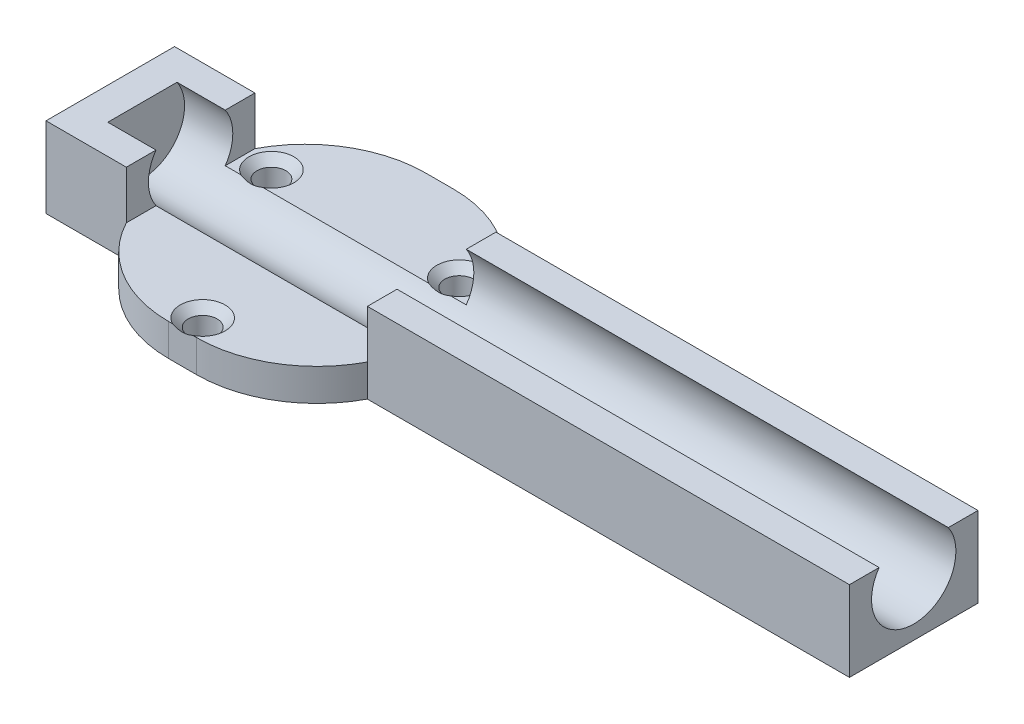
ISO-10303-21;
HEADER;
FILE_DESCRIPTION(('STEP AP214'),'2;1');
FILE_NAME('part.step','',(''),(''),'','','');
FILE_SCHEMA(('AUTOMOTIVE_DESIGN { 1 0 10303 214 1 1 1 1 }'));
ENDSEC;
DATA;
#1=APPLICATION_CONTEXT('core data for automotive mechanical design processes');
#2=APPLICATION_PROTOCOL_DEFINITION('international standard','automotive_design',2000,#1);
#3=PRODUCT_CONTEXT('',#1,'mechanical');
#4=PRODUCT('Part','Part','',(#3));
#5=PRODUCT_RELATED_PRODUCT_CATEGORY('part','',(#4));
#6=PRODUCT_DEFINITION_FORMATION('','',#4);
#7=PRODUCT_DEFINITION_CONTEXT('part definition',#1,'design');
#8=PRODUCT_DEFINITION('design','',#6,#7);
#9=PRODUCT_DEFINITION_SHAPE('','',#8);
#10=(LENGTH_UNIT() NAMED_UNIT(*) SI_UNIT(.MILLI.,.METRE.));
#11=(NAMED_UNIT(*) PLANE_ANGLE_UNIT() SI_UNIT($,.RADIAN.));
#12=(NAMED_UNIT(*) SI_UNIT($,.STERADIAN.) SOLID_ANGLE_UNIT());
#13=UNCERTAINTY_MEASURE_WITH_UNIT(LENGTH_MEASURE(1.E-05),#10,'distance_accuracy_value','');
#14=(GEOMETRIC_REPRESENTATION_CONTEXT(3) GLOBAL_UNCERTAINTY_ASSIGNED_CONTEXT((#13)) GLOBAL_UNIT_ASSIGNED_CONTEXT((#10,
#11,#12)) REPRESENTATION_CONTEXT('',''));
#15=CARTESIAN_POINT('',(0.,0.,0.));
#16=DIRECTION('',(0.,0.,1.));
#17=DIRECTION('',(1.,0.,0.));
#18=AXIS2_PLACEMENT_3D('',#15,#16,#17);
#19=CARTESIAN_POINT('',(30.,4.,8.));
#20=DIRECTION('',(0.,0.,-1.));
#21=DIRECTION('',(-1.,0.,0.));
#22=AXIS2_PLACEMENT_3D('',#19,#20,#21);
#23=PLANE('',#22);
#24=DIRECTION('',(0.,-1.,0.));
#25=VECTOR('',#24,1.);
#26=CARTESIAN_POINT('',(0.,4.,8.));
#27=LINE('',#26,#25);
#28=CARTESIAN_POINT('',(0.,4.,8.));
#29=VERTEX_POINT('',#28);
#30=CARTESIAN_POINT('',(0.,0.,8.));
#31=VERTEX_POINT('',#30);
#32=EDGE_CURVE('E226',#29,#31,#27,.T.);
#33=ORIENTED_EDGE('',*,*,#32,.F.);
#34=DIRECTION('',(0.,-1.,0.));
#35=VECTOR('',#34,1.);
#36=CARTESIAN_POINT('',(0.,10.,8.));
#37=LINE('',#36,#35);
#38=CARTESIAN_POINT('',(0.,10.,8.));
#39=VERTEX_POINT('',#38);
#40=EDGE_CURVE('E213',#39,#29,#37,.T.);
#41=ORIENTED_EDGE('',*,*,#40,.F.);
#42=DIRECTION('',(1.,0.,0.));
#43=VECTOR('',#42,1.);
#44=CARTESIAN_POINT('',(-9.99999999999999,10.,8.));
#45=LINE('',#44,#43);
#46=CARTESIAN_POINT('',(-9.99999999999999,10.,8.));
#47=VERTEX_POINT('',#46);
#48=EDGE_CURVE('E337',#47,#39,#45,.T.);
#49=ORIENTED_EDGE('',*,*,#48,.F.);
#50=DIRECTION('',(0.,-1.,0.));
#51=VECTOR('',#50,1.);
#52=CARTESIAN_POINT('',(-9.99999999999999,4.,8.));
#53=LINE('',#52,#51);
#54=CARTESIAN_POINT('',(-9.99999999999999,0.,8.));
#55=VERTEX_POINT('',#54);
#56=EDGE_CURVE('E232',#47,#55,#53,.T.);
#57=ORIENTED_EDGE('',*,*,#56,.T.);
#58=DIRECTION('',(1.,0.,0.));
#59=VECTOR('',#58,1.);
#60=CARTESIAN_POINT('',(0.,0.,8.));
#61=LINE('',#60,#59);
#62=EDGE_CURVE('E229',#55,#31,#61,.T.);
#63=ORIENTED_EDGE('',*,*,#62,.T.);
#64=EDGE_LOOP('',(#33,#41,#49,#57,#63));
#65=FACE_BOUND('',#64,.T.);
#66=ADVANCED_FACE('F42',(#65),#23,.F.);
#67=CARTESIAN_POINT('',(30.,4.,-8.));
#68=DIRECTION('',(0.,0.,1.));
#69=DIRECTION('',(1.,0.,0.));
#70=AXIS2_PLACEMENT_3D('',#67,#68,#69);
#71=PLANE('',#70);
#72=DIRECTION('',(-1.,0.,0.));
#73=VECTOR('',#72,1.);
#74=CARTESIAN_POINT('',(-9.99999999999999,10.,-8.));
#75=LINE('',#74,#73);
#76=CARTESIAN_POINT('',(0.,10.,-8.));
#77=VERTEX_POINT('',#76);
#78=CARTESIAN_POINT('',(-9.99999999999999,10.,-8.));
#79=VERTEX_POINT('',#78);
#80=EDGE_CURVE('E351',#77,#79,#75,.T.);
#81=ORIENTED_EDGE('',*,*,#80,.F.);
#82=DIRECTION('',(0.,-1.,0.));
#83=VECTOR('',#82,1.);
#84=CARTESIAN_POINT('',(0.,4.,-8.));
#85=LINE('',#84,#83);
#86=CARTESIAN_POINT('',(0.,4.,-8.));
#87=VERTEX_POINT('',#86);
#88=EDGE_CURVE('E502',#77,#87,#85,.T.);
#89=ORIENTED_EDGE('',*,*,#88,.T.);
#90=DIRECTION('',(0.,-1.,0.));
#91=VECTOR('',#90,1.);
#92=CARTESIAN_POINT('',(0.,4.,-8.));
#93=LINE('',#92,#91);
#94=CARTESIAN_POINT('',(0.,0.,-8.));
#95=VERTEX_POINT('',#94);
#96=EDGE_CURVE('E408',#87,#95,#93,.T.);
#97=ORIENTED_EDGE('',*,*,#96,.T.);
#98=DIRECTION('',(-1.,0.,0.));
#99=VECTOR('',#98,1.);
#100=CARTESIAN_POINT('',(0.,0.,-8.));
#101=LINE('',#100,#99);
#102=CARTESIAN_POINT('',(-9.99999999999999,0.,-8.));
#103=VERTEX_POINT('',#102);
#104=EDGE_CURVE('E370',#95,#103,#101,.T.);
#105=ORIENTED_EDGE('',*,*,#104,.T.);
#106=DIRECTION('',(0.,-1.,0.));
#107=VECTOR('',#106,1.);
#108=CARTESIAN_POINT('',(-9.99999999999999,4.,-8.));
#109=LINE('',#108,#107);
#110=EDGE_CURVE('E404',#79,#103,#109,.T.);
#111=ORIENTED_EDGE('',*,*,#110,.F.);
#112=EDGE_LOOP('',(#81,#89,#97,#105,#111));
#113=FACE_BOUND('',#112,.T.);
#114=ADVANCED_FACE('F308',(#113),#71,.F.);
#115=CARTESIAN_POINT('',(0.,10.,0.));
#116=DIRECTION('',(0.,1.,0.));
#117=DIRECTION('',(0.,0.,1.));
#118=AXIS2_PLACEMENT_3D('',#115,#116,#117);
#119=PLANE('',#118);
#120=DIRECTION('',(0.,0.,1.));
#121=VECTOR('',#120,1.);
#122=CARTESIAN_POINT('',(0.,10.,-16.));
#123=LINE('',#122,#121);
#124=CARTESIAN_POINT('',(0.,10.,-4.30842198490352));
#125=VERTEX_POINT('',#124);
#126=EDGE_CURVE('E517',#77,#125,#123,.T.);
#127=ORIENTED_EDGE('',*,*,#126,.F.);
#128=ORIENTED_EDGE('',*,*,#80,.T.);
#129=DIRECTION('',(0.,0.,1.));
#130=VECTOR('',#129,1.);
#131=CARTESIAN_POINT('',(-9.99999999999999,10.,-8.));
#132=LINE('',#131,#130);
#133=EDGE_CURVE('E338',#79,#47,#132,.T.);
#134=ORIENTED_EDGE('',*,*,#133,.T.);
#135=ORIENTED_EDGE('',*,*,#48,.T.);
#136=CARTESIAN_POINT('',(0.,10.,4.30842198490352));
#137=VERTEX_POINT('',#136);
#138=EDGE_CURVE('E217',#137,#39,#123,.T.);
#139=ORIENTED_EDGE('',*,*,#138,.F.);
#140=DIRECTION('',(1.,0.,0.));
#141=VECTOR('',#140,1.);
#142=CARTESIAN_POINT('',(-24.8492424049175,10.,4.30842198490352));
#143=LINE('',#142,#141);
#144=CARTESIAN_POINT('',(-5.99999999999999,10.,4.30842198490352));
#145=VERTEX_POINT('',#144);
#146=EDGE_CURVE('E422',#145,#137,#143,.T.);
#147=ORIENTED_EDGE('',*,*,#146,.F.);
#148=DIRECTION('',(0.,0.,-1.));
#149=VECTOR('',#148,1.);
#150=CARTESIAN_POINT('',(-5.99999999999999,10.,0.));
#151=LINE('',#150,#149);
#152=CARTESIAN_POINT('',(-5.99999999999999,10.,-4.30842198490352));
#153=VERTEX_POINT('',#152);
#154=EDGE_CURVE('E412',#145,#153,#151,.T.);
#155=ORIENTED_EDGE('',*,*,#154,.T.);
#156=DIRECTION('',(1.,0.,0.));
#157=VECTOR('',#156,1.);
#158=CARTESIAN_POINT('',(-24.8492424049175,10.,-4.30842198490352));
#159=LINE('',#158,#157);
#160=EDGE_CURVE('E416',#125,#153,#159,.F.);
#161=ORIENTED_EDGE('',*,*,#160,.F.);
#162=EDGE_LOOP('',(#127,#128,#134,#135,#139,#147,#155,#161));
#163=FACE_BOUND('',#162,.T.);
#164=ADVANCED_FACE('F312',(#163),#119,.T.);
#165=DIRECTION('',(0.,0.,1.));
#166=VECTOR('',#165,1.);
#167=CARTESIAN_POINT('',(30.,10.,-16.));
#168=LINE('',#167,#166);
#169=CARTESIAN_POINT('',(30.,10.,4.30842198490352));
#170=VERTEX_POINT('',#169);
#171=CARTESIAN_POINT('',(30.,10.,8.));
#172=VERTEX_POINT('',#171);
#173=EDGE_CURVE('E533',#170,#172,#168,.T.);
#174=ORIENTED_EDGE('',*,*,#173,.T.);
#175=CARTESIAN_POINT('',(90.,10.,8.));
#176=VERTEX_POINT('',#175);
#177=EDGE_CURVE('E327',#172,#176,#45,.T.);
#178=ORIENTED_EDGE('',*,*,#177,.T.);
#179=DIRECTION('',(0.,0.,-1.));
#180=VECTOR('',#179,1.);
#181=CARTESIAN_POINT('',(90.,10.,-8.));
#182=LINE('',#181,#180);
#183=CARTESIAN_POINT('',(90.,10.,4.30842198490352));
#184=VERTEX_POINT('',#183);
#185=EDGE_CURVE('E348',#176,#184,#182,.T.);
#186=ORIENTED_EDGE('',*,*,#185,.T.);
#187=EDGE_CURVE('E421',#170,#184,#143,.T.);
#188=ORIENTED_EDGE('',*,*,#187,.F.);
#189=EDGE_LOOP('',(#174,#178,#186,#188));
#190=FACE_BOUND('',#189,.T.);
#191=ADVANCED_FACE('F557',(#190),#119,.T.);
#192=CARTESIAN_POINT('',(0.,4.,0.));
#193=DIRECTION('',(0.,-1.,0.));
#194=DIRECTION('',(0.,0.,-1.));
#195=AXIS2_PLACEMENT_3D('',#192,#193,#194);
#196=PLANE('',#195);
#197=DIRECTION('',(1.,0.,0.));
#198=VECTOR('',#197,1.);
#199=CARTESIAN_POINT('',(-24.8492424049175,4.,-4.30842198490352));
#200=LINE('',#199,#198);
#201=CARTESIAN_POINT('',(1.93800144074376,4.,-4.30842198490352));
#202=VERTEX_POINT('',#201);
#203=CARTESIAN_POINT('',(0.,4.,-4.30842198490352));
#204=VERTEX_POINT('',#203);
#205=EDGE_CURVE('E436',#202,#204,#200,.F.);
#206=ORIENTED_EDGE('',*,*,#205,.F.);
#207=CARTESIAN_POINT('',(3.30865704891007,4.,-6.75));
#208=DIRECTION('',(0.,-1.,0.));
#209=DIRECTION('',(0.,0.,-1.));
#210=AXIS2_PLACEMENT_3D('',#207,#208,#209);
#211=CIRCLE('',#210,2.80000000000004);
#212=CARTESIAN_POINT('',(4.67931265707639,4.,-4.30842198490352));
#213=VERTEX_POINT('',#212);
#214=EDGE_CURVE('E565',#202,#213,#211,.T.);
#215=ORIENTED_EDGE('',*,*,#214,.T.);
#216=CARTESIAN_POINT('',(25.3206873429237,4.,-4.30842198490352));
#217=VERTEX_POINT('',#216);
#218=EDGE_CURVE('E442',#217,#213,#200,.F.);
#219=ORIENTED_EDGE('',*,*,#218,.F.);
#220=CARTESIAN_POINT('',(26.6913429510899,4.,-6.75000000000001));
#221=DIRECTION('',(0.,-1.,0.));
#222=DIRECTION('',(0.,0.,-1.));
#223=AXIS2_PLACEMENT_3D('',#220,#221,#222);
#224=CIRCLE('',#223,2.8);
#225=CARTESIAN_POINT('',(28.0619985592561,4.,-4.30842198490352));
#226=VERTEX_POINT('',#225);
#227=EDGE_CURVE('E564',#217,#226,#224,.T.);
#228=ORIENTED_EDGE('',*,*,#227,.T.);
#229=CARTESIAN_POINT('',(30.,4.,-4.30842198490352));
#230=VERTEX_POINT('',#229);
#231=EDGE_CURVE('E438',#230,#226,#200,.F.);
#232=ORIENTED_EDGE('',*,*,#231,.F.);
#233=DIRECTION('',(0.,0.,1.));
#234=VECTOR('',#233,1.);
#235=CARTESIAN_POINT('',(30.,4.,-16.));
#236=LINE('',#235,#234);
#237=CARTESIAN_POINT('',(30.,4.,-8.));
#238=VERTEX_POINT('',#237);
#239=EDGE_CURVE('E493',#238,#230,#236,.T.);
#240=ORIENTED_EDGE('',*,*,#239,.F.);
#241=CARTESIAN_POINT('',(16.7335008385784,4.,-1.));
#242=DIRECTION('',(0.,-1.,0.));
#243=DIRECTION('',(0.,0.,-1.));
#244=AXIS2_PLACEMENT_3D('',#241,#242,#243);
#245=CIRCLE('',#244,15.);
#246=CARTESIAN_POINT('',(16.7335008385784,4.,-16.));
#247=VERTEX_POINT('',#246);
#248=EDGE_CURVE('E465',#238,#247,#245,.F.);
#249=ORIENTED_EDGE('',*,*,#248,.T.);
#250=DIRECTION('',(-1.,0.,0.));
#251=VECTOR('',#250,1.);
#252=CARTESIAN_POINT('',(0.,4.,-16.));
#253=LINE('',#252,#251);
#254=CARTESIAN_POINT('',(13.2664991614216,4.,-16.));
#255=VERTEX_POINT('',#254);
#256=EDGE_CURVE('E357',#247,#255,#253,.T.);
#257=ORIENTED_EDGE('',*,*,#256,.T.);
#258=CARTESIAN_POINT('',(13.2664991614216,4.,-1.));
#259=DIRECTION('',(0.,-1.,0.));
#260=DIRECTION('',(0.,0.,-1.));
#261=AXIS2_PLACEMENT_3D('',#258,#259,#260);
#262=CIRCLE('',#261,15.);
#263=EDGE_CURVE('E462',#255,#87,#262,.F.);
#264=ORIENTED_EDGE('',*,*,#263,.T.);
#265=DIRECTION('',(0.,0.,1.));
#266=VECTOR('',#265,1.);
#267=CARTESIAN_POINT('',(0.,4.,-16.));
#268=LINE('',#267,#266);
#269=EDGE_CURVE('E209',#87,#204,#268,.T.);
#270=ORIENTED_EDGE('',*,*,#269,.T.);
#271=EDGE_LOOP('',(#206,#215,#219,#228,#232,#240,#249,#257,#264,#270));
#272=FACE_BOUND('',#271,.T.);
#273=ADVANCED_FACE('F490',(#272),#196,.F.);
#274=DIRECTION('',(1.,0.,0.));
#275=VECTOR('',#274,1.);
#276=CARTESIAN_POINT('',(0.,4.,16.));
#277=LINE('',#276,#275);
#278=CARTESIAN_POINT('',(13.2664991614216,4.,16.));
#279=VERTEX_POINT('',#278);
#280=CARTESIAN_POINT('',(13.7390479787081,4.,16.));
#281=VERTEX_POINT('',#280);
#282=EDGE_CURVE('E363',#279,#281,#277,.T.);
#283=ORIENTED_EDGE('',*,*,#282,.T.);
#284=CARTESIAN_POINT('',(15.,4.,13.5));
#285=DIRECTION('',(0.,-1.,0.));
#286=DIRECTION('',(0.,0.,-1.));
#287=AXIS2_PLACEMENT_3D('',#284,#285,#286);
#288=CIRCLE('',#287,2.80000000000001);
#289=CARTESIAN_POINT('',(16.2609520212919,4.,16.));
#290=VERTEX_POINT('',#289);
#291=EDGE_CURVE('E254',#281,#290,#288,.T.);
#292=ORIENTED_EDGE('',*,*,#291,.T.);
#293=CARTESIAN_POINT('',(16.7335008385784,4.,16.));
#294=VERTEX_POINT('',#293);
#295=EDGE_CURVE('E361',#290,#294,#277,.T.);
#296=ORIENTED_EDGE('',*,*,#295,.T.);
#297=CARTESIAN_POINT('',(16.7335008385784,4.,1.));
#298=DIRECTION('',(0.,-1.,0.));
#299=DIRECTION('',(0.,0.,-1.));
#300=AXIS2_PLACEMENT_3D('',#297,#298,#299);
#301=CIRCLE('',#300,15.);
#302=CARTESIAN_POINT('',(30.,4.,8.));
#303=VERTEX_POINT('',#302);
#304=EDGE_CURVE('E240',#294,#303,#301,.F.);
#305=ORIENTED_EDGE('',*,*,#304,.T.);
#306=CARTESIAN_POINT('',(30.,4.,4.30842198490352));
#307=VERTEX_POINT('',#306);
#308=EDGE_CURVE('E506',#307,#303,#236,.T.);
#309=ORIENTED_EDGE('',*,*,#308,.F.);
#310=DIRECTION('',(1.,0.,0.));
#311=VECTOR('',#310,1.);
#312=CARTESIAN_POINT('',(-24.8492424049175,4.,4.30842198490352));
#313=LINE('',#312,#311);
#314=CARTESIAN_POINT('',(0.,4.,4.30842198490352));
#315=VERTEX_POINT('',#314);
#316=EDGE_CURVE('E205',#315,#307,#313,.T.);
#317=ORIENTED_EDGE('',*,*,#316,.F.);
#318=EDGE_CURVE('E197',#315,#29,#268,.T.);
#319=ORIENTED_EDGE('',*,*,#318,.T.);
#320=CARTESIAN_POINT('',(13.2664991614216,4.,1.));
#321=DIRECTION('',(0.,-1.,0.));
#322=DIRECTION('',(0.,0.,-1.));
#323=AXIS2_PLACEMENT_3D('',#320,#321,#322);
#324=CIRCLE('',#323,15.);
#325=EDGE_CURVE('E202',#29,#279,#324,.F.);
#326=ORIENTED_EDGE('',*,*,#325,.T.);
#327=EDGE_LOOP('',(#283,#292,#296,#305,#309,#317,#319,#326));
#328=FACE_BOUND('',#327,.T.);
#329=ADVANCED_FACE('F200',(#328),#196,.F.);
#330=CARTESIAN_POINT('',(0.,4.,-16.));
#331=DIRECTION('',(0.,0.,1.));
#332=DIRECTION('',(1.,0.,0.));
#333=AXIS2_PLACEMENT_3D('',#330,#331,#332);
#334=PLANE('',#333);
#335=ORIENTED_EDGE('',*,*,#256,.F.);
#336=DIRECTION('',(0.,1.,0.));
#337=VECTOR('',#336,1.);
#338=CARTESIAN_POINT('',(16.7335008385784,4.,-16.));
#339=LINE('',#338,#337);
#340=CARTESIAN_POINT('',(16.7335008385784,0.,-16.));
#341=VERTEX_POINT('',#340);
#342=EDGE_CURVE('E446',#247,#341,#339,.F.);
#343=ORIENTED_EDGE('',*,*,#342,.T.);
#344=DIRECTION('',(-1.,0.,0.));
#345=VECTOR('',#344,1.);
#346=CARTESIAN_POINT('',(0.,0.,-16.));
#347=LINE('',#346,#345);
#348=CARTESIAN_POINT('',(13.2664991614216,0.,-16.));
#349=VERTEX_POINT('',#348);
#350=EDGE_CURVE('E356',#341,#349,#347,.T.);
#351=ORIENTED_EDGE('',*,*,#350,.T.);
#352=DIRECTION('',(0.,-1.,0.));
#353=VECTOR('',#352,1.);
#354=CARTESIAN_POINT('',(13.2664991614216,4.,-16.));
#355=LINE('',#354,#353);
#356=EDGE_CURVE('E443',#349,#255,#355,.F.);
#357=ORIENTED_EDGE('',*,*,#356,.T.);
#358=EDGE_LOOP('',(#335,#343,#351,#357));
#359=FACE_BOUND('',#358,.T.);
#360=ADVANCED_FACE('F284',(#359),#334,.F.);
#361=CARTESIAN_POINT('',(-9.99999999999999,4.,-8.));
#362=DIRECTION('',(1.,0.,0.));
#363=DIRECTION('',(0.,0.,-1.));
#364=AXIS2_PLACEMENT_3D('',#361,#362,#363);
#365=PLANE('',#364);
#366=DIRECTION('',(0.,0.,1.));
#367=VECTOR('',#366,1.);
#368=CARTESIAN_POINT('',(-9.99999999999999,0.,-8.));
#369=LINE('',#368,#367);
#370=EDGE_CURVE('E373',#103,#55,#369,.T.);
#371=ORIENTED_EDGE('',*,*,#370,.T.);
#372=ORIENTED_EDGE('',*,*,#56,.F.);
#373=ORIENTED_EDGE('',*,*,#133,.F.);
#374=ORIENTED_EDGE('',*,*,#110,.T.);
#375=EDGE_LOOP('',(#371,#372,#373,#374));
#376=FACE_BOUND('',#375,.T.);
#377=ADVANCED_FACE('F279',(#376),#365,.F.);
#378=CARTESIAN_POINT('',(0.,4.,16.));
#379=DIRECTION('',(0.,0.,-1.));
#380=DIRECTION('',(-1.,0.,0.));
#381=AXIS2_PLACEMENT_3D('',#378,#379,#380);
#382=PLANE('',#381);
#383=ORIENTED_EDGE('',*,*,#295,.F.);
#384=CARTESIAN_POINT('',(16.2609520212919,4.,16.));
#385=CARTESIAN_POINT('',(16.1715105803298,3.9597316010225,16.));
#386=CARTESIAN_POINT('',(16.0806800517677,3.92223067769474,16.));
#387=CARTESIAN_POINT('',(15.8960177486682,3.85432342059107,16.));
#388=CARTESIAN_POINT('',(15.8021755303453,3.82394571512567,16.));
#389=CARTESIAN_POINT('',(15.6131406275182,3.77250673600112,16.));
#390=CARTESIAN_POINT('',(15.5179785538511,3.75133592883665,16.));
#391=CARTESIAN_POINT('',(15.3260410841887,3.71940061188559,16.));
#392=CARTESIAN_POINT('',(15.2292685748645,3.70861917394741,16.));
#393=CARTESIAN_POINT('',(15.042169124603,3.6987383467488,16.));
#394=CARTESIAN_POINT('',(14.9518842382415,3.69884774937727,16.));
#395=CARTESIAN_POINT('',(14.7718135663888,3.70878072109171,16.));
#396=CARTESIAN_POINT('',(14.682028064694,3.71860933907154,16.));
#397=CARTESIAN_POINT('',(14.5039392508191,3.74722220312435,16.));
#398=CARTESIAN_POINT('',(14.4156357790063,3.76600547817949,16.));
#399=CARTESIAN_POINT('',(14.2410314095087,3.81130492726555,16.));
#400=CARTESIAN_POINT('',(14.1547312675019,3.83782396973958,16.));
#401=CARTESIAN_POINT('',(14.0134105971368,3.88711449864426,16.));
#402=CARTESIAN_POINT('',(13.9577471810741,3.90808627872838,16.));
#403=CARTESIAN_POINT('',(13.8475837182794,3.95236904853473,16.));
#404=CARTESIAN_POINT('',(13.7930802656668,3.97567154273801,16.));
#405=CARTESIAN_POINT('',(13.7390479787081,3.99999999999982,16.));
#406=B_SPLINE_CURVE_WITH_KNOTS('',3,(#384,#385,#386,#387,#388,#389,#390,#391,#392,#393,#394,
#395,#396,#397,#398,#399,#400,#401,#402,#403,#404,#405),.UNSPECIFIED.,.F.,.F.,(4,2,2,2,2,2,2,2,
2,2,4),(0.,0.294415117886569,0.589993955195256,0.881953132017152,1.17343579019597,
1.44375917721837,1.71422306441509,1.98465762993714,2.25519260106041,2.43358915642009,
2.61135763737686),.UNSPECIFIED.);
#407=EDGE_CURVE('E258',#290,#281,#406,.T.);
#408=ORIENTED_EDGE('',*,*,#407,.T.);
#409=ORIENTED_EDGE('',*,*,#282,.F.);
#410=DIRECTION('',(0.,1.,0.));
#411=VECTOR('',#410,1.);
#412=CARTESIAN_POINT('',(13.2664991614216,4.,16.));
#413=LINE('',#412,#411);
#414=CARTESIAN_POINT('',(13.2664991614216,0.,16.));
#415=VERTEX_POINT('',#414);
#416=EDGE_CURVE('E238',#279,#415,#413,.F.);
#417=ORIENTED_EDGE('',*,*,#416,.T.);
#418=DIRECTION('',(1.,0.,0.));
#419=VECTOR('',#418,1.);
#420=CARTESIAN_POINT('',(0.,0.,16.));
#421=LINE('',#420,#419);
#422=CARTESIAN_POINT('',(16.7335008385784,0.,16.));
#423=VERTEX_POINT('',#422);
#424=EDGE_CURVE('E378',#415,#423,#421,.T.);
#425=ORIENTED_EDGE('',*,*,#424,.T.);
#426=DIRECTION('',(0.,-1.,0.));
#427=VECTOR('',#426,1.);
#428=CARTESIAN_POINT('',(16.7335008385784,4.,16.));
#429=LINE('',#428,#427);
#430=EDGE_CURVE('E241',#423,#294,#429,.F.);
#431=ORIENTED_EDGE('',*,*,#430,.T.);
#432=EDGE_LOOP('',(#383,#408,#409,#417,#425,#431));
#433=FACE_BOUND('',#432,.T.);
#434=ADVANCED_FACE('F273',(#433),#382,.F.);
#435=ORIENTED_EDGE('',*,*,#177,.F.);
#436=DIRECTION('',(0.,1.,0.));
#437=VECTOR('',#436,1.);
#438=CARTESIAN_POINT('',(30.,10.,8.));
#439=LINE('',#438,#437);
#440=EDGE_CURVE('E210',#303,#172,#439,.T.);
#441=ORIENTED_EDGE('',*,*,#440,.F.);
#442=DIRECTION('',(0.,-1.,0.));
#443=VECTOR('',#442,1.);
#444=CARTESIAN_POINT('',(30.,4.,8.));
#445=LINE('',#444,#443);
#446=CARTESIAN_POINT('',(30.,0.,8.));
#447=VERTEX_POINT('',#446);
#448=EDGE_CURVE('E233',#303,#447,#445,.T.);
#449=ORIENTED_EDGE('',*,*,#448,.T.);
#450=DIRECTION('',(1.,0.,0.));
#451=VECTOR('',#450,1.);
#452=CARTESIAN_POINT('',(30.,0.,8.));
#453=LINE('',#452,#451);
#454=CARTESIAN_POINT('',(90.,0.,8.));
#455=VERTEX_POINT('',#454);
#456=EDGE_CURVE('E382',#447,#455,#453,.T.);
#457=ORIENTED_EDGE('',*,*,#456,.T.);
#458=DIRECTION('',(0.,-1.,0.));
#459=VECTOR('',#458,1.);
#460=CARTESIAN_POINT('',(90.,4.,8.));
#461=LINE('',#460,#459);
#462=EDGE_CURVE('E331',#176,#455,#461,.T.);
#463=ORIENTED_EDGE('',*,*,#462,.F.);
#464=EDGE_LOOP('',(#435,#441,#449,#457,#463));
#465=FACE_BOUND('',#464,.T.);
#466=ADVANCED_FACE('F278',(#465),#23,.F.);
#467=CARTESIAN_POINT('',(90.,4.,-8.));
#468=DIRECTION('',(-1.,0.,0.));
#469=DIRECTION('',(0.,0.,1.));
#470=AXIS2_PLACEMENT_3D('',#467,#468,#469);
#471=PLANE('',#470);
#472=CARTESIAN_POINT('',(90.,10.,-4.30842198490352));
#473=VERTEX_POINT('',#472);
#474=CARTESIAN_POINT('',(90.,10.,-8.));
#475=VERTEX_POINT('',#474);
#476=EDGE_CURVE('E342',#473,#475,#182,.T.);
#477=ORIENTED_EDGE('',*,*,#476,.F.);
#478=CARTESIAN_POINT('',(90.,7.,0.));
#479=DIRECTION('',(1.,0.,0.));
#480=DIRECTION('',(0.,0.,-1.));
#481=AXIS2_PLACEMENT_3D('',#478,#479,#480);
#482=CIRCLE('',#481,5.25);
#483=EDGE_CURVE('E511',#184,#473,#482,.T.);
#484=ORIENTED_EDGE('',*,*,#483,.F.);
#485=ORIENTED_EDGE('',*,*,#185,.F.);
#486=ORIENTED_EDGE('',*,*,#462,.T.);
#487=DIRECTION('',(0.,0.,-1.));
#488=VECTOR('',#487,1.);
#489=CARTESIAN_POINT('',(90.,0.,-8.));
#490=LINE('',#489,#488);
#491=CARTESIAN_POINT('',(90.,0.,-8.));
#492=VERTEX_POINT('',#491);
#493=EDGE_CURVE('E385',#455,#492,#490,.T.);
#494=ORIENTED_EDGE('',*,*,#493,.T.);
#495=DIRECTION('',(0.,-1.,0.));
#496=VECTOR('',#495,1.);
#497=CARTESIAN_POINT('',(90.,4.,-8.));
#498=LINE('',#497,#496);
#499=EDGE_CURVE('E394',#475,#492,#498,.T.);
#500=ORIENTED_EDGE('',*,*,#499,.F.);
#501=EDGE_LOOP('',(#477,#484,#485,#486,#494,#500));
#502=FACE_BOUND('',#501,.T.);
#503=ADVANCED_FACE('F317',(#502),#471,.F.);
#504=DIRECTION('',(0.,-1.,0.));
#505=VECTOR('',#504,1.);
#506=CARTESIAN_POINT('',(30.,4.,-8.));
#507=LINE('',#506,#505);
#508=CARTESIAN_POINT('',(30.,0.,-8.));
#509=VERTEX_POINT('',#508);
#510=EDGE_CURVE('E366',#238,#509,#507,.T.);
#511=ORIENTED_EDGE('',*,*,#510,.F.);
#512=DIRECTION('',(0.,1.,0.));
#513=VECTOR('',#512,1.);
#514=CARTESIAN_POINT('',(30.,4.,-8.));
#515=LINE('',#514,#513);
#516=CARTESIAN_POINT('',(30.,10.,-8.));
#517=VERTEX_POINT('',#516);
#518=EDGE_CURVE('E512',#238,#517,#515,.T.);
#519=ORIENTED_EDGE('',*,*,#518,.T.);
#520=EDGE_CURVE('E352',#475,#517,#75,.T.);
#521=ORIENTED_EDGE('',*,*,#520,.F.);
#522=ORIENTED_EDGE('',*,*,#499,.T.);
#523=DIRECTION('',(-1.,0.,0.));
#524=VECTOR('',#523,1.);
#525=CARTESIAN_POINT('',(30.,0.,-8.));
#526=LINE('',#525,#524);
#527=EDGE_CURVE('E362',#492,#509,#526,.T.);
#528=ORIENTED_EDGE('',*,*,#527,.T.);
#529=EDGE_LOOP('',(#511,#519,#521,#522,#528));
#530=FACE_BOUND('',#529,.T.);
#531=ADVANCED_FACE('F315',(#530),#71,.F.);
#532=CARTESIAN_POINT('',(0.,0.,0.));
#533=DIRECTION('',(0.,-1.,0.));
#534=DIRECTION('',(0.,0.,-1.));
#535=AXIS2_PLACEMENT_3D('',#532,#533,#534);
#536=PLANE('',#535);
#537=CARTESIAN_POINT('',(15.,0.,13.5));
#538=DIRECTION('',(0.,1.,0.));
#539=DIRECTION('',(0.,0.,1.));
#540=AXIS2_PLACEMENT_3D('',#537,#538,#539);
#541=CIRCLE('',#540,1.8);
#542=CARTESIAN_POINT('',(15.,0.,15.3));
#543=VERTEX_POINT('',#542);
#544=EDGE_CURVE('E222',#543,#543,#541,.T.);
#545=ORIENTED_EDGE('',*,*,#544,.T.);
#546=EDGE_LOOP('',(#545));
#547=FACE_BOUND('',#546,.T.);
#548=CARTESIAN_POINT('',(3.30865704891007,0.,-6.75));
#549=DIRECTION('',(0.,1.,0.));
#550=DIRECTION('',(0.,0.,1.));
#551=AXIS2_PLACEMENT_3D('',#548,#549,#550);
#552=CIRCLE('',#551,1.8);
#553=CARTESIAN_POINT('',(3.30865704891007,0.,-4.95));
#554=VERTEX_POINT('',#553);
#555=EDGE_CURVE('E839',#554,#554,#552,.T.);
#556=ORIENTED_EDGE('',*,*,#555,.T.);
#557=EDGE_LOOP('',(#556));
#558=FACE_BOUND('',#557,.T.);
#559=CARTESIAN_POINT('',(26.6913429510899,0.,-6.75000000000001));
#560=DIRECTION('',(0.,1.,0.));
#561=DIRECTION('',(0.,0.,1.));
#562=AXIS2_PLACEMENT_3D('',#559,#560,#561);
#563=CIRCLE('',#562,1.8);
#564=CARTESIAN_POINT('',(26.6913429510899,0.,-4.95000000000001));
#565=VERTEX_POINT('',#564);
#566=EDGE_CURVE('E842',#565,#565,#563,.T.);
#567=ORIENTED_EDGE('',*,*,#566,.T.);
#568=EDGE_LOOP('',(#567));
#569=FACE_BOUND('',#568,.T.);
#570=ORIENTED_EDGE('',*,*,#350,.F.);
#571=CARTESIAN_POINT('',(16.7335008385784,0.,-1.));
#572=DIRECTION('',(0.,-1.,0.));
#573=DIRECTION('',(0.,0.,-1.));
#574=AXIS2_PLACEMENT_3D('',#571,#572,#573);
#575=CIRCLE('',#574,15.);
#576=EDGE_CURVE('E459',#341,#509,#575,.T.);
#577=ORIENTED_EDGE('',*,*,#576,.T.);
#578=ORIENTED_EDGE('',*,*,#527,.F.);
#579=ORIENTED_EDGE('',*,*,#493,.F.);
#580=ORIENTED_EDGE('',*,*,#456,.F.);
#581=CARTESIAN_POINT('',(16.7335008385784,0.,1.));
#582=DIRECTION('',(0.,-1.,0.));
#583=DIRECTION('',(0.,0.,-1.));
#584=AXIS2_PLACEMENT_3D('',#581,#582,#583);
#585=CIRCLE('',#584,15.);
#586=EDGE_CURVE('E453',#447,#423,#585,.T.);
#587=ORIENTED_EDGE('',*,*,#586,.T.);
#588=ORIENTED_EDGE('',*,*,#424,.F.);
#589=CARTESIAN_POINT('',(13.2664991614216,0.,1.));
#590=DIRECTION('',(0.,-1.,0.));
#591=DIRECTION('',(0.,0.,-1.));
#592=AXIS2_PLACEMENT_3D('',#589,#590,#591);
#593=CIRCLE('',#592,15.);
#594=EDGE_CURVE('E450',#415,#31,#593,.T.);
#595=ORIENTED_EDGE('',*,*,#594,.T.);
#596=ORIENTED_EDGE('',*,*,#62,.F.);
#597=ORIENTED_EDGE('',*,*,#370,.F.);
#598=ORIENTED_EDGE('',*,*,#104,.F.);
#599=CARTESIAN_POINT('',(13.2664991614216,0.,-1.));
#600=DIRECTION('',(0.,-1.,0.));
#601=DIRECTION('',(0.,0.,-1.));
#602=AXIS2_PLACEMENT_3D('',#599,#600,#601);
#603=CIRCLE('',#602,15.);
#604=EDGE_CURVE('E456',#95,#349,#603,.T.);
#605=ORIENTED_EDGE('',*,*,#604,.T.);
#606=EDGE_LOOP('',(#570,#577,#578,#579,#580,#587,#588,#595,#596,#597,#598,#605));
#607=FACE_BOUND('',#606,.T.);
#608=ADVANCED_FACE('F473',(#547,#558,#569,#607),#536,.T.);
#609=CARTESIAN_POINT('',(30.,10.,-4.30842198490352));
#610=VERTEX_POINT('',#609);
#611=EDGE_CURVE('E528',#517,#610,#168,.T.);
#612=ORIENTED_EDGE('',*,*,#611,.T.);
#613=EDGE_CURVE('E417',#473,#610,#159,.F.);
#614=ORIENTED_EDGE('',*,*,#613,.F.);
#615=ORIENTED_EDGE('',*,*,#476,.T.);
#616=ORIENTED_EDGE('',*,*,#520,.T.);
#617=EDGE_LOOP('',(#612,#614,#615,#616));
#618=FACE_BOUND('',#617,.T.);
#619=ADVANCED_FACE('F555',(#618),#119,.T.);
#620=CARTESIAN_POINT('',(-24.8492424049175,7.,0.));
#621=DIRECTION('',(1.,0.,0.));
#622=DIRECTION('',(0.,0.,-1.));
#623=AXIS2_PLACEMENT_3D('',#620,#621,#622);
#624=CYLINDRICAL_SURFACE('',#623,5.25);
#625=ORIENTED_EDGE('',*,*,#218,.T.);
#626=CARTESIAN_POINT('',(4.67931265707639,4.,-4.30842198490352));
#627=CARTESIAN_POINT('',(4.62384033686736,3.98310335022936,-4.29665650354338));
#628=CARTESIAN_POINT('',(4.56797792422223,3.96714646297532,-4.28539823930604));
#629=CARTESIAN_POINT('',(4.45549965047062,3.93718829823093,-4.26403830929113));
#630=CARTESIAN_POINT('',(4.3988836249778,3.92318745533273,-4.25393690063225));
#631=CARTESIAN_POINT('',(4.22787143829514,3.88421852251882,-4.22557042717711));
#632=CARTESIAN_POINT('',(4.11241943941054,3.8623172761605,-4.20926661362074));
#633=CARTESIAN_POINT('',(3.88333939684492,3.82782766197056,-4.18333306860038));
#634=CARTESIAN_POINT('',(3.76977706154162,3.81495558673073,-4.17350068157982));
#635=CARTESIAN_POINT('',(3.54170191295418,3.79769735521951,-4.16027382681234));
#636=CARTESIAN_POINT('',(3.42718981030224,3.79330534416847,-4.15687491731571));
#637=CARTESIAN_POINT('',(3.19750706634261,3.79310472662726,-4.15672022700308));
#638=CARTESIAN_POINT('',(3.08233635197889,3.79734465002909,-4.16000200590319));
#639=CARTESIAN_POINT('',(2.85293682998483,3.81439877820776,-4.17307533501256));
#640=CARTESIAN_POINT('',(2.73870874391288,3.82721902785148,-4.18287147457827));
#641=CARTESIAN_POINT('',(2.50826501024866,3.8617059418876,-4.20881085338646));
#642=CARTESIAN_POINT('',(2.39211586183767,3.88366134234833,-4.22516054871309));
#643=CARTESIAN_POINT('',(2.2200816082859,3.92278587775077,-4.25364665111854));
#644=CARTESIAN_POINT('',(2.1631292632624,3.93685085169109,-4.26379630969943));
#645=CARTESIAN_POINT('',(2.04998698827936,3.96696059488873,-4.28526709649772));
#646=CARTESIAN_POINT('',(1.99379688918318,3.98300491669559,-4.29658795986005));
#647=CARTESIAN_POINT('',(1.93800144074376,3.99999999999997,-4.30842198490355));
#648=B_SPLINE_CURVE_WITH_KNOTS('',3,(#626,#627,#628,#629,#630,#631,#632,#633,#634,#635,#636,
#637,#638,#639,#640,#641,#642,#643,#644,#645,#646,#647),.UNSPECIFIED.,.F.,.F.,(4,2,2,2,2,2,2,2,
2,2,4),(0.,0.177489640195619,0.355018652376322,0.710422622315173,1.05408774045833,
1.39751550143091,1.74287939068721,2.0884868463671,2.44596542452384,2.62452901886856,
2.80305232092562),.UNSPECIFIED.);
#649=EDGE_CURVE('E53',#213,#202,#648,.T.);
#650=ORIENTED_EDGE('',*,*,#649,.T.);
#651=ORIENTED_EDGE('',*,*,#205,.T.);
#652=CARTESIAN_POINT('',(0.,7.,0.));
#653=DIRECTION('',(-1.,0.,0.));
#654=DIRECTION('',(0.,-1.,0.));
#655=AXIS2_PLACEMENT_3D('',#652,#653,#654);
#656=CIRCLE('',#655,5.25);
#657=EDGE_CURVE('E437',#204,#125,#656,.F.);
#658=ORIENTED_EDGE('',*,*,#657,.T.);
#659=ORIENTED_EDGE('',*,*,#160,.T.);
#660=CARTESIAN_POINT('',(-5.99999999999999,7.,0.));
#661=DIRECTION('',(1.,0.,0.));
#662=DIRECTION('',(0.,0.,-1.));
#663=AXIS2_PLACEMENT_3D('',#660,#661,#662);
#664=CIRCLE('',#663,5.25);
#665=EDGE_CURVE('E344',#153,#145,#664,.F.);
#666=ORIENTED_EDGE('',*,*,#665,.T.);
#667=ORIENTED_EDGE('',*,*,#146,.T.);
#668=EDGE_CURVE('E432',#137,#315,#656,.F.);
#669=ORIENTED_EDGE('',*,*,#668,.T.);
#670=ORIENTED_EDGE('',*,*,#316,.T.);
#671=CARTESIAN_POINT('',(30.,7.,0.));
#672=DIRECTION('',(1.,0.,0.));
#673=DIRECTION('',(0.,0.,-1.));
#674=AXIS2_PLACEMENT_3D('',#671,#672,#673);
#675=CIRCLE('',#674,5.25);
#676=EDGE_CURVE('E428',#307,#170,#675,.F.);
#677=ORIENTED_EDGE('',*,*,#676,.T.);
#678=ORIENTED_EDGE('',*,*,#187,.T.);
#679=ORIENTED_EDGE('',*,*,#483,.T.);
#680=ORIENTED_EDGE('',*,*,#613,.T.);
#681=EDGE_CURVE('E433',#610,#230,#675,.F.);
#682=ORIENTED_EDGE('',*,*,#681,.T.);
#683=ORIENTED_EDGE('',*,*,#231,.T.);
#684=CARTESIAN_POINT('',(28.0619985592561,4.,-4.30842198490352));
#685=CARTESIAN_POINT('',(28.0065262390471,3.98310335022937,-4.29665650354339));
#686=CARTESIAN_POINT('',(27.950663826402,3.96714646297532,-4.28539823930604));
#687=CARTESIAN_POINT('',(27.8381855526504,3.93718829823094,-4.26403830929113));
#688=CARTESIAN_POINT('',(27.7815695271576,3.92318745533274,-4.25393690063226));
#689=CARTESIAN_POINT('',(27.6105573404749,3.88421852251883,-4.22557042717712));
#690=CARTESIAN_POINT('',(27.4951053415903,3.86231727616051,-4.20926661362075));
#691=CARTESIAN_POINT('',(27.2660252990247,3.82782766197058,-4.18333306860039));
#692=CARTESIAN_POINT('',(27.1524629637214,3.81495558673075,-4.17350068157983));
#693=CARTESIAN_POINT('',(26.9243878151339,3.79769735521954,-4.16027382681236));
#694=CARTESIAN_POINT('',(26.809875712482,3.7933053441685,-4.15687491731573));
#695=CARTESIAN_POINT('',(26.5801929685224,3.79310472662729,-4.1567202270031));
#696=CARTESIAN_POINT('',(26.4650222541587,3.79734465002913,-4.16000200590321));
#697=CARTESIAN_POINT('',(26.2356227321647,3.81439877820779,-4.17307533501259));
#698=CARTESIAN_POINT('',(26.1213946460927,3.82721902785152,-4.18287147457829));
#699=CARTESIAN_POINT('',(25.8909509124285,3.86170594188762,-4.20881085338648));
#700=CARTESIAN_POINT('',(25.7748017640176,3.88366134234835,-4.22516054871311));
#701=CARTESIAN_POINT('',(25.6027675104658,3.92278587775078,-4.25364665111855));
#702=CARTESIAN_POINT('',(25.5458151654423,3.93685085169111,-4.26379630969944));
#703=CARTESIAN_POINT('',(25.4326728904593,3.96696059488874,-4.28526709649772));
#704=CARTESIAN_POINT('',(25.3764827913631,3.9830049166956,-4.29658795986005));
#705=CARTESIAN_POINT('',(25.3206873429237,3.99999999999997,-4.30842198490355));
#706=B_SPLINE_CURVE_WITH_KNOTS('',3,(#684,#685,#686,#687,#688,#689,#690,#691,#692,#693,#694,
#695,#696,#697,#698,#699,#700,#701,#702,#703,#704,#705),.UNSPECIFIED.,.F.,.F.,(4,2,2,2,2,2,2,2,
2,2,4),(0.,0.177489640195611,0.355018652376312,0.710422622315158,1.05408774045831,
1.39751550143087,1.74287939068713,2.08848684636698,2.44596542452368,2.62452901886836,
2.8030523209254),.UNSPECIFIED.);
#707=EDGE_CURVE('E561',#226,#217,#706,.T.);
#708=ORIENTED_EDGE('',*,*,#707,.T.);
#709=EDGE_LOOP('',(#625,#650,#651,#658,#659,#666,#667,#669,#670,#677,#678,#679,#680,#682,#683,#708));
#710=FACE_BOUND('',#709,.T.);
#711=ADVANCED_FACE('F523',(#710),#624,.F.);
#712=CARTESIAN_POINT('',(-5.99999999999999,4.,-8.));
#713=DIRECTION('',(1.,0.,0.));
#714=DIRECTION('',(0.,0.,-1.));
#715=AXIS2_PLACEMENT_3D('',#712,#713,#714);
#716=PLANE('',#715);
#717=ORIENTED_EDGE('',*,*,#665,.F.);
#718=ORIENTED_EDGE('',*,*,#154,.F.);
#719=EDGE_LOOP('',(#717,#718));
#720=FACE_BOUND('',#719,.T.);
#721=ADVANCED_FACE('F588',(#720),#716,.T.);
#722=CARTESIAN_POINT('',(30.,10.,-16.));
#723=DIRECTION('',(1.,0.,0.));
#724=DIRECTION('',(0.,0.,-1.));
#725=AXIS2_PLACEMENT_3D('',#722,#723,#724);
#726=PLANE('',#725);
#727=ORIENTED_EDGE('',*,*,#308,.T.);
#728=ORIENTED_EDGE('',*,*,#440,.T.);
#729=ORIENTED_EDGE('',*,*,#173,.F.);
#730=ORIENTED_EDGE('',*,*,#676,.F.);
#731=EDGE_LOOP('',(#727,#728,#729,#730));
#732=FACE_BOUND('',#731,.T.);
#733=ADVANCED_FACE('F626',(#732),#726,.F.);
#734=CARTESIAN_POINT('',(0.,10.,-16.));
#735=DIRECTION('',(-1.,0.,0.));
#736=DIRECTION('',(0.,-1.,0.));
#737=AXIS2_PLACEMENT_3D('',#734,#735,#736);
#738=PLANE('',#737);
#739=ORIENTED_EDGE('',*,*,#138,.T.);
#740=ORIENTED_EDGE('',*,*,#40,.T.);
#741=ORIENTED_EDGE('',*,*,#318,.F.);
#742=ORIENTED_EDGE('',*,*,#668,.F.);
#743=EDGE_LOOP('',(#739,#740,#741,#742));
#744=FACE_BOUND('',#743,.T.);
#745=ADVANCED_FACE('F215',(#744),#738,.F.);
#746=ORIENTED_EDGE('',*,*,#126,.T.);
#747=ORIENTED_EDGE('',*,*,#657,.F.);
#748=ORIENTED_EDGE('',*,*,#269,.F.);
#749=ORIENTED_EDGE('',*,*,#88,.F.);
#750=EDGE_LOOP('',(#746,#747,#748,#749));
#751=FACE_BOUND('',#750,.T.);
#752=ADVANCED_FACE('F501',(#751),#738,.F.);
#753=ORIENTED_EDGE('',*,*,#239,.T.);
#754=ORIENTED_EDGE('',*,*,#681,.F.);
#755=ORIENTED_EDGE('',*,*,#611,.F.);
#756=ORIENTED_EDGE('',*,*,#518,.F.);
#757=EDGE_LOOP('',(#753,#754,#755,#756));
#758=FACE_BOUND('',#757,.T.);
#759=ADVANCED_FACE('F545',(#758),#726,.F.);
#760=CARTESIAN_POINT('',(26.6913429510899,0.,-6.75000000000001));
#761=DIRECTION('',(0.,1.,0.));
#762=DIRECTION('',(0.,0.,1.));
#763=AXIS2_PLACEMENT_3D('',#760,#761,#762);
#764=CYLINDRICAL_SURFACE('',#763,1.8);
#765=CARTESIAN_POINT('',(26.6913429510899,3.00000000000001,-6.75000000000001));
#766=DIRECTION('',(0.,-1.,0.));
#767=DIRECTION('',(0.,0.,-1.));
#768=AXIS2_PLACEMENT_3D('',#765,#766,#767);
#769=CIRCLE('',#768,1.8);
#770=CARTESIAN_POINT('',(26.6913429510899,3.00000000000001,-8.55000000000001));
#771=VERTEX_POINT('',#770);
#772=EDGE_CURVE('E12',#771,#771,#769,.F.);
#773=ORIENTED_EDGE('',*,*,#772,.T.);
#774=EDGE_LOOP('',(#773));
#775=FACE_BOUND('',#774,.T.);
#776=ORIENTED_EDGE('',*,*,#566,.F.);
#777=EDGE_LOOP('',(#776));
#778=FACE_BOUND('',#777,.T.);
#779=ADVANCED_FACE('F647',(#775,#778),#764,.F.);
#780=CARTESIAN_POINT('',(3.30865704891007,0.,-6.75));
#781=DIRECTION('',(0.,1.,0.));
#782=DIRECTION('',(0.,0.,1.));
#783=AXIS2_PLACEMENT_3D('',#780,#781,#782);
#784=CYLINDRICAL_SURFACE('',#783,1.8);
#785=CARTESIAN_POINT('',(3.30865704891007,2.99999999999997,-6.75));
#786=DIRECTION('',(0.,-1.,0.));
#787=DIRECTION('',(0.,0.,-1.));
#788=AXIS2_PLACEMENT_3D('',#785,#786,#787);
#789=CIRCLE('',#788,1.8);
#790=CARTESIAN_POINT('',(3.30865704891007,2.99999999999997,-8.55));
#791=VERTEX_POINT('',#790);
#792=EDGE_CURVE('E267',#791,#791,#789,.F.);
#793=ORIENTED_EDGE('',*,*,#792,.T.);
#794=EDGE_LOOP('',(#793));
#795=FACE_BOUND('',#794,.T.);
#796=ORIENTED_EDGE('',*,*,#555,.F.);
#797=EDGE_LOOP('',(#796));
#798=FACE_BOUND('',#797,.T.);
#799=ADVANCED_FACE('F654',(#795,#798),#784,.F.);
#800=CARTESIAN_POINT('',(15.,0.,13.5));
#801=DIRECTION('',(0.,1.,0.));
#802=DIRECTION('',(0.,0.,1.));
#803=AXIS2_PLACEMENT_3D('',#800,#801,#802);
#804=CYLINDRICAL_SURFACE('',#803,1.8);
#805=CARTESIAN_POINT('',(15.,2.99999999999998,13.5));
#806=DIRECTION('',(0.,-1.,0.));
#807=DIRECTION('',(0.,0.,-1.));
#808=AXIS2_PLACEMENT_3D('',#805,#806,#807);
#809=CIRCLE('',#808,1.8);
#810=CARTESIAN_POINT('',(15.,2.99999999999998,11.7));
#811=VERTEX_POINT('',#810);
#812=EDGE_CURVE('E245',#811,#811,#809,.F.);
#813=ORIENTED_EDGE('',*,*,#812,.T.);
#814=EDGE_LOOP('',(#813));
#815=FACE_BOUND('',#814,.T.);
#816=ORIENTED_EDGE('',*,*,#544,.F.);
#817=EDGE_LOOP('',(#816));
#818=FACE_BOUND('',#817,.T.);
#819=ADVANCED_FACE('F293',(#815,#818),#804,.F.);
#820=CARTESIAN_POINT('',(16.7335008385784,4.,-1.));
#821=DIRECTION('',(0.,1.,0.));
#822=DIRECTION('',(0.,0.,1.));
#823=AXIS2_PLACEMENT_3D('',#820,#821,#822);
#824=CYLINDRICAL_SURFACE('',#823,15.);
#825=ORIENTED_EDGE('',*,*,#248,.F.);
#826=ORIENTED_EDGE('',*,*,#510,.T.);
#827=ORIENTED_EDGE('',*,*,#576,.F.);
#828=ORIENTED_EDGE('',*,*,#342,.F.);
#829=EDGE_LOOP('',(#825,#826,#827,#828));
#830=FACE_BOUND('',#829,.T.);
#831=ADVANCED_FACE('F289',(#830),#824,.T.);
#832=CARTESIAN_POINT('',(13.2664991614216,4.,-1.));
#833=DIRECTION('',(0.,-1.,0.));
#834=DIRECTION('',(0.,0.,-1.));
#835=AXIS2_PLACEMENT_3D('',#832,#833,#834);
#836=CYLINDRICAL_SURFACE('',#835,15.);
#837=ORIENTED_EDGE('',*,*,#263,.F.);
#838=ORIENTED_EDGE('',*,*,#356,.F.);
#839=ORIENTED_EDGE('',*,*,#604,.F.);
#840=ORIENTED_EDGE('',*,*,#96,.F.);
#841=EDGE_LOOP('',(#837,#838,#839,#840));
#842=FACE_BOUND('',#841,.T.);
#843=ADVANCED_FACE('F292',(#842),#836,.T.);
#844=CARTESIAN_POINT('',(16.7335008385784,4.,1.));
#845=DIRECTION('',(0.,-1.,0.));
#846=DIRECTION('',(0.,0.,-1.));
#847=AXIS2_PLACEMENT_3D('',#844,#845,#846);
#848=CYLINDRICAL_SURFACE('',#847,15.);
#849=ORIENTED_EDGE('',*,*,#304,.F.);
#850=ORIENTED_EDGE('',*,*,#430,.F.);
#851=ORIENTED_EDGE('',*,*,#586,.F.);
#852=ORIENTED_EDGE('',*,*,#448,.F.);
#853=EDGE_LOOP('',(#849,#850,#851,#852));
#854=FACE_BOUND('',#853,.T.);
#855=ADVANCED_FACE('F297',(#854),#848,.T.);
#856=CARTESIAN_POINT('',(13.2664991614216,4.,1.));
#857=DIRECTION('',(0.,1.,0.));
#858=DIRECTION('',(0.,0.,1.));
#859=AXIS2_PLACEMENT_3D('',#856,#857,#858);
#860=CYLINDRICAL_SURFACE('',#859,15.);
#861=ORIENTED_EDGE('',*,*,#325,.F.);
#862=ORIENTED_EDGE('',*,*,#32,.T.);
#863=ORIENTED_EDGE('',*,*,#594,.F.);
#864=ORIENTED_EDGE('',*,*,#416,.F.);
#865=EDGE_LOOP('',(#861,#862,#863,#864));
#866=FACE_BOUND('',#865,.T.);
#867=ADVANCED_FACE('F236',(#866),#860,.T.);
#868=CARTESIAN_POINT('',(15.,2.99999999999998,13.5));
#869=DIRECTION('',(0.,1.,0.));
#870=DIRECTION('',(0.,0.,1.));
#871=AXIS2_PLACEMENT_3D('',#868,#869,#870);
#872=CONICAL_SURFACE('',#871,1.8,0.785398163397446);
#873=ORIENTED_EDGE('',*,*,#407,.F.);
#874=ORIENTED_EDGE('',*,*,#291,.F.);
#875=EDGE_LOOP('',(#873,#874));
#876=FACE_BOUND('',#875,.T.);
#877=ORIENTED_EDGE('',*,*,#812,.F.);
#878=EDGE_LOOP('',(#877));
#879=FACE_BOUND('',#878,.T.);
#880=ADVANCED_FACE('F270',(#876,#879),#872,.F.);
#881=CARTESIAN_POINT('',(3.30865704891007,2.99999999999997,-6.75));
#882=DIRECTION('',(0.,1.,0.));
#883=DIRECTION('',(0.,0.,1.));
#884=AXIS2_PLACEMENT_3D('',#881,#882,#883);
#885=CONICAL_SURFACE('',#884,1.8,0.785398163397452);
#886=ORIENTED_EDGE('',*,*,#649,.F.);
#887=ORIENTED_EDGE('',*,*,#214,.F.);
#888=EDGE_LOOP('',(#886,#887));
#889=FACE_BOUND('',#888,.T.);
#890=ORIENTED_EDGE('',*,*,#792,.F.);
#891=EDGE_LOOP('',(#890));
#892=FACE_BOUND('',#891,.T.);
#893=ADVANCED_FACE('F305',(#889,#892),#885,.F.);
#894=CARTESIAN_POINT('',(26.6913429510899,3.00000000000001,-6.75000000000001));
#895=DIRECTION('',(0.,1.,0.));
#896=DIRECTION('',(0.,0.,1.));
#897=AXIS2_PLACEMENT_3D('',#894,#895,#896);
#898=CONICAL_SURFACE('',#897,1.8,0.785398163397452);
#899=ORIENTED_EDGE('',*,*,#707,.F.);
#900=ORIENTED_EDGE('',*,*,#227,.F.);
#901=EDGE_LOOP('',(#899,#900));
#902=FACE_BOUND('',#901,.T.);
#903=ORIENTED_EDGE('',*,*,#772,.F.);
#904=EDGE_LOOP('',(#903));
#905=FACE_BOUND('',#904,.T.);
#906=ADVANCED_FACE('F45',(#902,#905),#898,.F.);
#907=CLOSED_SHELL('',(#66,#114,#164,#191,#273,#329,#360,#377,#434,#466,#503,#531,#608,#619,#711,
#721,#733,#745,#752,#759,#779,#799,#819,#831,#843,#855,#867,#880,#893,#906));
#908=MANIFOLD_SOLID_BREP('B2',#907);
#909=ADVANCED_BREP_SHAPE_REPRESENTATION('',(#18,#908),#14);
#910=SHAPE_DEFINITION_REPRESENTATION(#9,#909);
ENDSEC;
END-ISO-10303-21;
